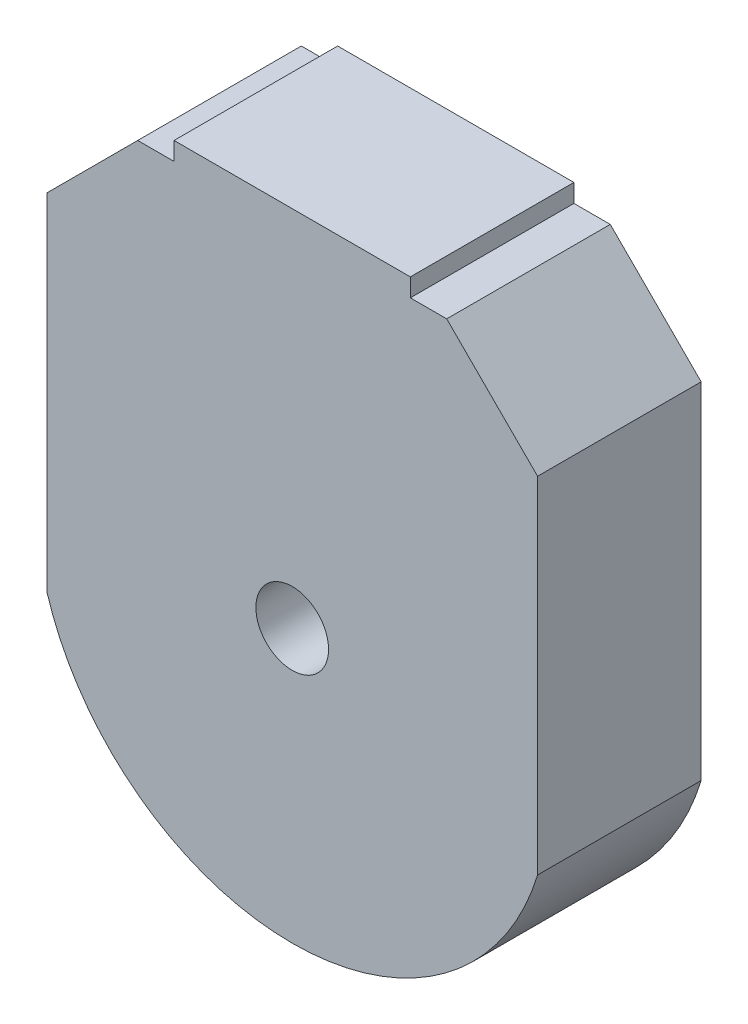
ISO-10303-21;
HEADER;
FILE_DESCRIPTION(('STEP AP214'),'2;1');
FILE_NAME('part.step','',(''),(''),'','','');
FILE_SCHEMA(('AUTOMOTIVE_DESIGN { 1 0 10303 214 1 1 1 1 }'));
ENDSEC;
DATA;
#1=APPLICATION_CONTEXT('core data for automotive mechanical design processes');
#2=APPLICATION_PROTOCOL_DEFINITION('international standard','automotive_design',2000,#1);
#3=PRODUCT_CONTEXT('',#1,'mechanical');
#4=PRODUCT('Part','Part','',(#3));
#5=PRODUCT_RELATED_PRODUCT_CATEGORY('part','',(#4));
#6=PRODUCT_DEFINITION_FORMATION('','',#4);
#7=PRODUCT_DEFINITION_CONTEXT('part definition',#1,'design');
#8=PRODUCT_DEFINITION('design','',#6,#7);
#9=PRODUCT_DEFINITION_SHAPE('','',#8);
#10=(LENGTH_UNIT() NAMED_UNIT(*) SI_UNIT(.MILLI.,.METRE.));
#11=(NAMED_UNIT(*) PLANE_ANGLE_UNIT() SI_UNIT($,.RADIAN.));
#12=(NAMED_UNIT(*) SI_UNIT($,.STERADIAN.) SOLID_ANGLE_UNIT());
#13=UNCERTAINTY_MEASURE_WITH_UNIT(LENGTH_MEASURE(1.E-05),#10,'distance_accuracy_value','');
#14=(GEOMETRIC_REPRESENTATION_CONTEXT(3) GLOBAL_UNCERTAINTY_ASSIGNED_CONTEXT((#13)) GLOBAL_UNIT_ASSIGNED_CONTEXT((#10,
#11,#12)) REPRESENTATION_CONTEXT('',''));
#15=CARTESIAN_POINT('',(0.,0.,0.));
#16=DIRECTION('',(0.,0.,1.));
#17=DIRECTION('',(1.,0.,0.));
#18=AXIS2_PLACEMENT_3D('',#15,#16,#17);
#19=CARTESIAN_POINT('',(0.,14.1125,9.));
#20=DIRECTION('',(0.,0.,1.));
#21=DIRECTION('',(1.,0.,0.));
#22=AXIS2_PLACEMENT_3D('',#19,#20,#21);
#23=PLANE('',#22);
#24=DIRECTION('',(0.,-1.,0.));
#25=VECTOR('',#24,1.);
#26=CARTESIAN_POINT('',(-6.5,35.,9.));
#27=LINE('',#26,#25);
#28=CARTESIAN_POINT('',(-6.5,35.,9.));
#29=VERTEX_POINT('',#28);
#30=CARTESIAN_POINT('',(-6.5,34.,9.));
#31=VERTEX_POINT('',#30);
#32=EDGE_CURVE('E182',#29,#31,#27,.T.);
#33=ORIENTED_EDGE('',*,*,#32,.T.);
#34=DIRECTION('',(-1.,0.,0.));
#35=VECTOR('',#34,1.);
#36=CARTESIAN_POINT('',(-6.5,34.,9.));
#37=LINE('',#36,#35);
#38=CARTESIAN_POINT('',(-8.5,34.,9.));
#39=VERTEX_POINT('',#38);
#40=EDGE_CURVE('E106',#31,#39,#37,.T.);
#41=ORIENTED_EDGE('',*,*,#40,.T.);
#42=DIRECTION('',(-0.707106781186547,-0.707106781186548,0.));
#43=VECTOR('',#42,1.);
#44=CARTESIAN_POINT('',(-8.5,34.,9.));
#45=LINE('',#44,#43);
#46=CARTESIAN_POINT('',(-13.5,29.,9.));
#47=VERTEX_POINT('',#46);
#48=EDGE_CURVE('E211',#39,#47,#45,.T.);
#49=ORIENTED_EDGE('',*,*,#48,.T.);
#50=DIRECTION('',(0.,-1.,0.));
#51=VECTOR('',#50,1.);
#52=CARTESIAN_POINT('',(-13.5,29.,9.));
#53=LINE('',#52,#51);
#54=CARTESIAN_POINT('',(-13.5,10.,9.));
#55=VERTEX_POINT('',#54);
#56=EDGE_CURVE('E231',#47,#55,#53,.T.);
#57=ORIENTED_EDGE('',*,*,#56,.T.);
#58=CARTESIAN_POINT('',(0.,14.1125,9.));
#59=DIRECTION('',(0.,0.,1.));
#60=DIRECTION('',(1.,0.,0.));
#61=AXIS2_PLACEMENT_3D('',#58,#59,#60);
#62=CIRCLE('',#61,14.1125);
#63=CARTESIAN_POINT('',(13.5,10.,9.));
#64=VERTEX_POINT('',#63);
#65=EDGE_CURVE('E227',#55,#64,#62,.T.);
#66=ORIENTED_EDGE('',*,*,#65,.T.);
#67=DIRECTION('',(0.,1.,0.));
#68=VECTOR('',#67,1.);
#69=CARTESIAN_POINT('',(13.5,29.,9.));
#70=LINE('',#69,#68);
#71=CARTESIAN_POINT('',(13.5,29.,9.));
#72=VERTEX_POINT('',#71);
#73=EDGE_CURVE('E230',#64,#72,#70,.T.);
#74=ORIENTED_EDGE('',*,*,#73,.T.);
#75=DIRECTION('',(-0.707106781186547,0.707106781186548,0.));
#76=VECTOR('',#75,1.);
#77=CARTESIAN_POINT('',(8.5,34.,9.));
#78=LINE('',#77,#76);
#79=CARTESIAN_POINT('',(8.5,34.,9.));
#80=VERTEX_POINT('',#79);
#81=EDGE_CURVE('E131',#72,#80,#78,.T.);
#82=ORIENTED_EDGE('',*,*,#81,.T.);
#83=DIRECTION('',(-1.,0.,0.));
#84=VECTOR('',#83,1.);
#85=CARTESIAN_POINT('',(6.5,34.,9.));
#86=LINE('',#85,#84);
#87=CARTESIAN_POINT('',(6.5,34.,9.));
#88=VERTEX_POINT('',#87);
#89=EDGE_CURVE('E125',#80,#88,#86,.T.);
#90=ORIENTED_EDGE('',*,*,#89,.T.);
#91=DIRECTION('',(0.,1.,0.));
#92=VECTOR('',#91,1.);
#93=CARTESIAN_POINT('',(6.5,35.,9.));
#94=LINE('',#93,#92);
#95=CARTESIAN_POINT('',(6.5,35.,9.));
#96=VERTEX_POINT('',#95);
#97=EDGE_CURVE('E129',#88,#96,#94,.T.);
#98=ORIENTED_EDGE('',*,*,#97,.T.);
#99=DIRECTION('',(-1.,0.,0.));
#100=VECTOR('',#99,1.);
#101=CARTESIAN_POINT('',(6.5,35.,9.));
#102=LINE('',#101,#100);
#103=EDGE_CURVE('E57',#96,#29,#102,.T.);
#104=ORIENTED_EDGE('',*,*,#103,.T.);
#105=EDGE_LOOP('',(#33,#41,#49,#57,#66,#74,#82,#90,#98,#104));
#106=FACE_BOUND('',#105,.T.);
#107=CARTESIAN_POINT('',(0.,15.,9.));
#108=DIRECTION('',(0.,0.,1.));
#109=DIRECTION('',(1.,0.,0.));
#110=AXIS2_PLACEMENT_3D('',#107,#108,#109);
#111=CIRCLE('',#110,2.);
#112=CARTESIAN_POINT('',(2.,15.,9.));
#113=VERTEX_POINT('',#112);
#114=EDGE_CURVE('E158',#113,#113,#111,.T.);
#115=ORIENTED_EDGE('',*,*,#114,.F.);
#116=EDGE_LOOP('',(#115));
#117=FACE_BOUND('',#116,.T.);
#118=ADVANCED_FACE('F39',(#106,#117),#23,.T.);
#119=CARTESIAN_POINT('',(0.,14.1125,0.));
#120=DIRECTION('',(0.,0.,1.));
#121=DIRECTION('',(1.,0.,0.));
#122=AXIS2_PLACEMENT_3D('',#119,#120,#121);
#123=PLANE('',#122);
#124=DIRECTION('',(0.,-1.,0.));
#125=VECTOR('',#124,1.);
#126=CARTESIAN_POINT('',(-6.5,35.,0.));
#127=LINE('',#126,#125);
#128=CARTESIAN_POINT('',(-6.5,35.,0.));
#129=VERTEX_POINT('',#128);
#130=CARTESIAN_POINT('',(-6.5,34.,0.));
#131=VERTEX_POINT('',#130);
#132=EDGE_CURVE('E153',#129,#131,#127,.T.);
#133=ORIENTED_EDGE('',*,*,#132,.F.);
#134=DIRECTION('',(-1.,0.,0.));
#135=VECTOR('',#134,1.);
#136=CARTESIAN_POINT('',(6.5,35.,0.));
#137=LINE('',#136,#135);
#138=CARTESIAN_POINT('',(6.5,35.,0.));
#139=VERTEX_POINT('',#138);
#140=EDGE_CURVE('E98',#139,#129,#137,.T.);
#141=ORIENTED_EDGE('',*,*,#140,.F.);
#142=DIRECTION('',(0.,1.,0.));
#143=VECTOR('',#142,1.);
#144=CARTESIAN_POINT('',(6.5,35.,0.));
#145=LINE('',#144,#143);
#146=CARTESIAN_POINT('',(6.5,34.,0.));
#147=VERTEX_POINT('',#146);
#148=EDGE_CURVE('E92',#147,#139,#145,.T.);
#149=ORIENTED_EDGE('',*,*,#148,.F.);
#150=DIRECTION('',(-1.,0.,0.));
#151=VECTOR('',#150,1.);
#152=CARTESIAN_POINT('',(6.5,34.,0.));
#153=LINE('',#152,#151);
#154=CARTESIAN_POINT('',(8.5,34.,0.));
#155=VERTEX_POINT('',#154);
#156=EDGE_CURVE('E140',#155,#147,#153,.T.);
#157=ORIENTED_EDGE('',*,*,#156,.F.);
#158=DIRECTION('',(-0.707106781186547,0.707106781186548,0.));
#159=VECTOR('',#158,1.);
#160=CARTESIAN_POINT('',(8.5,34.,0.));
#161=LINE('',#160,#159);
#162=CARTESIAN_POINT('',(13.5,29.,0.));
#163=VERTEX_POINT('',#162);
#164=EDGE_CURVE('E173',#163,#155,#161,.T.);
#165=ORIENTED_EDGE('',*,*,#164,.F.);
#166=DIRECTION('',(0.,1.,0.));
#167=VECTOR('',#166,1.);
#168=CARTESIAN_POINT('',(13.5,29.,0.));
#169=LINE('',#168,#167);
#170=CARTESIAN_POINT('',(13.5,10.,0.));
#171=VERTEX_POINT('',#170);
#172=EDGE_CURVE('E170',#171,#163,#169,.T.);
#173=ORIENTED_EDGE('',*,*,#172,.F.);
#174=CARTESIAN_POINT('',(0.,14.1125,0.));
#175=DIRECTION('',(0.,0.,1.));
#176=DIRECTION('',(1.,0.,0.));
#177=AXIS2_PLACEMENT_3D('',#174,#175,#176);
#178=CIRCLE('',#177,14.1125);
#179=CARTESIAN_POINT('',(-13.5,10.,0.));
#180=VERTEX_POINT('',#179);
#181=EDGE_CURVE('E167',#180,#171,#178,.T.);
#182=ORIENTED_EDGE('',*,*,#181,.F.);
#183=DIRECTION('',(0.,-1.,0.));
#184=VECTOR('',#183,1.);
#185=CARTESIAN_POINT('',(-13.5,29.,0.));
#186=LINE('',#185,#184);
#187=CARTESIAN_POINT('',(-13.5,29.,0.));
#188=VERTEX_POINT('',#187);
#189=EDGE_CURVE('E164',#188,#180,#186,.T.);
#190=ORIENTED_EDGE('',*,*,#189,.F.);
#191=DIRECTION('',(-0.707106781186547,-0.707106781186548,0.));
#192=VECTOR('',#191,1.);
#193=CARTESIAN_POINT('',(-8.5,34.,0.));
#194=LINE('',#193,#192);
#195=CARTESIAN_POINT('',(-8.5,34.,0.));
#196=VERTEX_POINT('',#195);
#197=EDGE_CURVE('E161',#196,#188,#194,.T.);
#198=ORIENTED_EDGE('',*,*,#197,.F.);
#199=DIRECTION('',(-1.,0.,0.));
#200=VECTOR('',#199,1.);
#201=CARTESIAN_POINT('',(-6.5,34.,0.));
#202=LINE('',#201,#200);
#203=EDGE_CURVE('E157',#131,#196,#202,.T.);
#204=ORIENTED_EDGE('',*,*,#203,.F.);
#205=EDGE_LOOP('',(#133,#141,#149,#157,#165,#173,#182,#190,#198,#204));
#206=FACE_BOUND('',#205,.T.);
#207=CARTESIAN_POINT('',(0.,15.,0.));
#208=DIRECTION('',(0.,0.,1.));
#209=DIRECTION('',(1.,0.,0.));
#210=AXIS2_PLACEMENT_3D('',#207,#208,#209);
#211=CIRCLE('',#210,2.);
#212=CARTESIAN_POINT('',(2.,15.,0.));
#213=VERTEX_POINT('',#212);
#214=EDGE_CURVE('E245',#213,#213,#211,.T.);
#215=ORIENTED_EDGE('',*,*,#214,.T.);
#216=EDGE_LOOP('',(#215));
#217=FACE_BOUND('',#216,.T.);
#218=ADVANCED_FACE('F215',(#206,#217),#123,.F.);
#219=CARTESIAN_POINT('',(-6.5,35.,9.));
#220=DIRECTION('',(1.,0.,0.));
#221=DIRECTION('',(0.,0.,-1.));
#222=AXIS2_PLACEMENT_3D('',#219,#220,#221);
#223=PLANE('',#222);
#224=ORIENTED_EDGE('',*,*,#132,.T.);
#225=DIRECTION('',(0.,0.,-1.));
#226=VECTOR('',#225,1.);
#227=CARTESIAN_POINT('',(-6.5,34.,9.));
#228=LINE('',#227,#226);
#229=EDGE_CURVE('E11',#31,#131,#228,.T.);
#230=ORIENTED_EDGE('',*,*,#229,.F.);
#231=ORIENTED_EDGE('',*,*,#32,.F.);
#232=DIRECTION('',(0.,0.,-1.));
#233=VECTOR('',#232,1.);
#234=CARTESIAN_POINT('',(-6.5,35.,9.));
#235=LINE('',#234,#233);
#236=EDGE_CURVE('E149',#29,#129,#235,.T.);
#237=ORIENTED_EDGE('',*,*,#236,.T.);
#238=EDGE_LOOP('',(#224,#230,#231,#237));
#239=FACE_BOUND('',#238,.T.);
#240=ADVANCED_FACE('F41',(#239),#223,.F.);
#241=CARTESIAN_POINT('',(-6.5,34.,9.));
#242=DIRECTION('',(0.,-1.,0.));
#243=DIRECTION('',(0.,0.,-1.));
#244=AXIS2_PLACEMENT_3D('',#241,#242,#243);
#245=PLANE('',#244);
#246=ORIENTED_EDGE('',*,*,#203,.T.);
#247=DIRECTION('',(0.,0.,-1.));
#248=VECTOR('',#247,1.);
#249=CARTESIAN_POINT('',(-8.5,34.,9.));
#250=LINE('',#249,#248);
#251=EDGE_CURVE('E49',#39,#196,#250,.T.);
#252=ORIENTED_EDGE('',*,*,#251,.F.);
#253=ORIENTED_EDGE('',*,*,#40,.F.);
#254=ORIENTED_EDGE('',*,*,#229,.T.);
#255=EDGE_LOOP('',(#246,#252,#253,#254));
#256=FACE_BOUND('',#255,.T.);
#257=ADVANCED_FACE('F283',(#256),#245,.F.);
#258=CARTESIAN_POINT('',(-8.5,34.,9.));
#259=DIRECTION('',(0.707106781186548,-0.707106781186547,0.));
#260=DIRECTION('',(0.707106781186547,0.707106781186548,0.));
#261=AXIS2_PLACEMENT_3D('',#258,#259,#260);
#262=PLANE('',#261);
#263=ORIENTED_EDGE('',*,*,#197,.T.);
#264=DIRECTION('',(0.,0.,-1.));
#265=VECTOR('',#264,1.);
#266=CARTESIAN_POINT('',(-13.5,29.,9.));
#267=LINE('',#266,#265);
#268=EDGE_CURVE('E201',#47,#188,#267,.T.);
#269=ORIENTED_EDGE('',*,*,#268,.F.);
#270=ORIENTED_EDGE('',*,*,#48,.F.);
#271=ORIENTED_EDGE('',*,*,#251,.T.);
#272=EDGE_LOOP('',(#263,#269,#270,#271));
#273=FACE_BOUND('',#272,.T.);
#274=ADVANCED_FACE('F209',(#273),#262,.F.);
#275=CARTESIAN_POINT('',(-13.5,29.,9.));
#276=DIRECTION('',(1.,0.,0.));
#277=DIRECTION('',(0.,1.,0.));
#278=AXIS2_PLACEMENT_3D('',#275,#276,#277);
#279=PLANE('',#278);
#280=ORIENTED_EDGE('',*,*,#189,.T.);
#281=DIRECTION('',(0.,0.,-1.));
#282=VECTOR('',#281,1.);
#283=CARTESIAN_POINT('',(-13.5,10.,9.));
#284=LINE('',#283,#282);
#285=EDGE_CURVE('E197',#55,#180,#284,.T.);
#286=ORIENTED_EDGE('',*,*,#285,.F.);
#287=ORIENTED_EDGE('',*,*,#56,.F.);
#288=ORIENTED_EDGE('',*,*,#268,.T.);
#289=EDGE_LOOP('',(#280,#286,#287,#288));
#290=FACE_BOUND('',#289,.T.);
#291=ADVANCED_FACE('F221',(#290),#279,.F.);
#292=CARTESIAN_POINT('',(0.,14.1125,9.));
#293=DIRECTION('',(0.,0.,-1.));
#294=DIRECTION('',(-1.,0.,0.));
#295=AXIS2_PLACEMENT_3D('',#292,#293,#294);
#296=CYLINDRICAL_SURFACE('',#295,14.1125);
#297=ORIENTED_EDGE('',*,*,#181,.T.);
#298=DIRECTION('',(0.,0.,-1.));
#299=VECTOR('',#298,1.);
#300=CARTESIAN_POINT('',(13.5,10.,9.));
#301=LINE('',#300,#299);
#302=EDGE_CURVE('E193',#64,#171,#301,.T.);
#303=ORIENTED_EDGE('',*,*,#302,.F.);
#304=ORIENTED_EDGE('',*,*,#65,.F.);
#305=ORIENTED_EDGE('',*,*,#285,.T.);
#306=EDGE_LOOP('',(#297,#303,#304,#305));
#307=FACE_BOUND('',#306,.T.);
#308=ADVANCED_FACE('F225',(#307),#296,.T.);
#309=CARTESIAN_POINT('',(13.5,29.,9.));
#310=DIRECTION('',(-1.,0.,0.));
#311=DIRECTION('',(0.,-1.,0.));
#312=AXIS2_PLACEMENT_3D('',#309,#310,#311);
#313=PLANE('',#312);
#314=ORIENTED_EDGE('',*,*,#172,.T.);
#315=DIRECTION('',(0.,0.,-1.));
#316=VECTOR('',#315,1.);
#317=CARTESIAN_POINT('',(13.5,29.,9.));
#318=LINE('',#317,#316);
#319=EDGE_CURVE('E189',#72,#163,#318,.T.);
#320=ORIENTED_EDGE('',*,*,#319,.F.);
#321=ORIENTED_EDGE('',*,*,#73,.F.);
#322=ORIENTED_EDGE('',*,*,#302,.T.);
#323=EDGE_LOOP('',(#314,#320,#321,#322));
#324=FACE_BOUND('',#323,.T.);
#325=ADVANCED_FACE('F273',(#324),#313,.F.);
#326=CARTESIAN_POINT('',(8.5,34.,9.));
#327=DIRECTION('',(-0.707106781186548,-0.707106781186547,0.));
#328=DIRECTION('',(0.707106781186547,-0.707106781186548,0.));
#329=AXIS2_PLACEMENT_3D('',#326,#327,#328);
#330=PLANE('',#329);
#331=ORIENTED_EDGE('',*,*,#164,.T.);
#332=DIRECTION('',(0.,0.,-1.));
#333=VECTOR('',#332,1.);
#334=CARTESIAN_POINT('',(8.5,34.,9.));
#335=LINE('',#334,#333);
#336=EDGE_CURVE('E142',#80,#155,#335,.T.);
#337=ORIENTED_EDGE('',*,*,#336,.F.);
#338=ORIENTED_EDGE('',*,*,#81,.F.);
#339=ORIENTED_EDGE('',*,*,#319,.T.);
#340=EDGE_LOOP('',(#331,#337,#338,#339));
#341=FACE_BOUND('',#340,.T.);
#342=ADVANCED_FACE('F270',(#341),#330,.F.);
#343=CARTESIAN_POINT('',(6.5,34.,9.));
#344=DIRECTION('',(0.,-1.,0.));
#345=DIRECTION('',(0.,0.,-1.));
#346=AXIS2_PLACEMENT_3D('',#343,#344,#345);
#347=PLANE('',#346);
#348=ORIENTED_EDGE('',*,*,#156,.T.);
#349=DIRECTION('',(0.,0.,-1.));
#350=VECTOR('',#349,1.);
#351=CARTESIAN_POINT('',(6.5,34.,9.));
#352=LINE('',#351,#350);
#353=EDGE_CURVE('E137',#88,#147,#352,.T.);
#354=ORIENTED_EDGE('',*,*,#353,.F.);
#355=ORIENTED_EDGE('',*,*,#89,.F.);
#356=ORIENTED_EDGE('',*,*,#336,.T.);
#357=EDGE_LOOP('',(#348,#354,#355,#356));
#358=FACE_BOUND('',#357,.T.);
#359=ADVANCED_FACE('F138',(#358),#347,.F.);
#360=CARTESIAN_POINT('',(6.5,35.,9.));
#361=DIRECTION('',(-1.,0.,0.));
#362=DIRECTION('',(0.,0.,1.));
#363=AXIS2_PLACEMENT_3D('',#360,#361,#362);
#364=PLANE('',#363);
#365=ORIENTED_EDGE('',*,*,#148,.T.);
#366=DIRECTION('',(0.,0.,-1.));
#367=VECTOR('',#366,1.);
#368=CARTESIAN_POINT('',(6.5,35.,9.));
#369=LINE('',#368,#367);
#370=EDGE_CURVE('E143',#96,#139,#369,.T.);
#371=ORIENTED_EDGE('',*,*,#370,.F.);
#372=ORIENTED_EDGE('',*,*,#97,.F.);
#373=ORIENTED_EDGE('',*,*,#353,.T.);
#374=EDGE_LOOP('',(#365,#371,#372,#373));
#375=FACE_BOUND('',#374,.T.);
#376=ADVANCED_FACE('F145',(#375),#364,.F.);
#377=CARTESIAN_POINT('',(6.5,35.,9.));
#378=DIRECTION('',(0.,-1.,0.));
#379=DIRECTION('',(0.,0.,-1.));
#380=AXIS2_PLACEMENT_3D('',#377,#378,#379);
#381=PLANE('',#380);
#382=ORIENTED_EDGE('',*,*,#140,.T.);
#383=ORIENTED_EDGE('',*,*,#236,.F.);
#384=ORIENTED_EDGE('',*,*,#103,.F.);
#385=ORIENTED_EDGE('',*,*,#370,.T.);
#386=EDGE_LOOP('',(#382,#383,#384,#385));
#387=FACE_BOUND('',#386,.T.);
#388=ADVANCED_FACE('F263',(#387),#381,.F.);
#389=CARTESIAN_POINT('',(0.,15.,9.));
#390=DIRECTION('',(0.,0.,-1.));
#391=DIRECTION('',(-1.,0.,0.));
#392=AXIS2_PLACEMENT_3D('',#389,#390,#391);
#393=CYLINDRICAL_SURFACE('',#392,2.);
#394=ORIENTED_EDGE('',*,*,#114,.T.);
#395=EDGE_LOOP('',(#394));
#396=FACE_BOUND('',#395,.T.);
#397=ORIENTED_EDGE('',*,*,#214,.F.);
#398=EDGE_LOOP('',(#397));
#399=FACE_BOUND('',#398,.T.);
#400=ADVANCED_FACE('F253',(#396,#399),#393,.F.);
#401=CLOSED_SHELL('',(#118,#218,#240,#257,#274,#291,#308,#325,#342,#359,#376,#388,#400));
#402=MANIFOLD_SOLID_BREP('B2',#401);
#403=ADVANCED_BREP_SHAPE_REPRESENTATION('',(#18,#402),#14);
#404=SHAPE_DEFINITION_REPRESENTATION(#9,#403);
ENDSEC;
END-ISO-10303-21;
